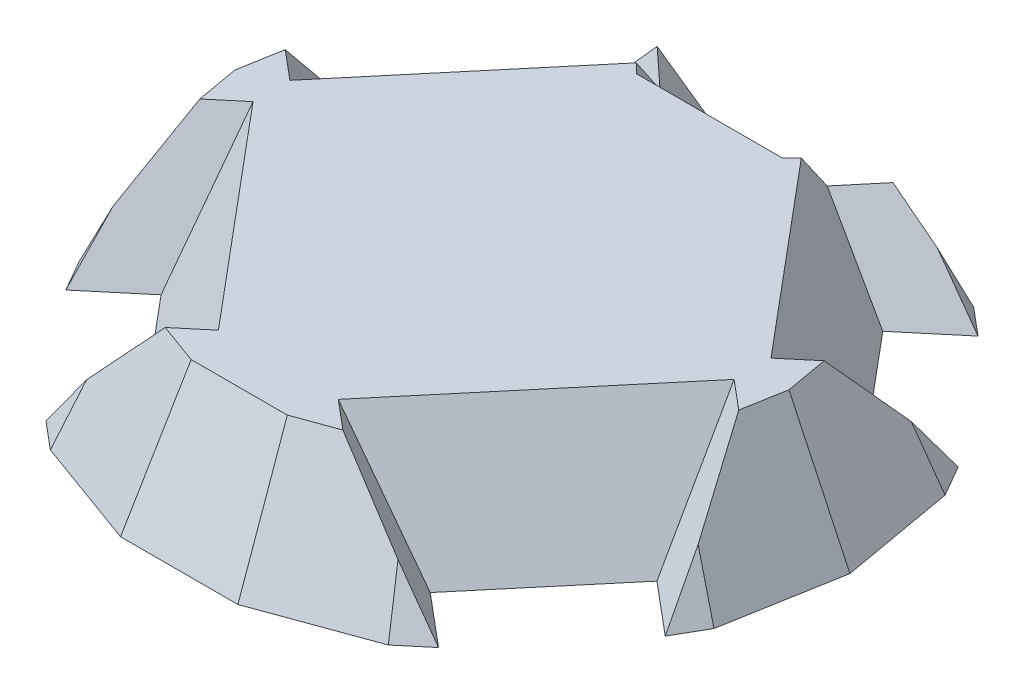
ISO-10303-21;
HEADER;
FILE_DESCRIPTION(('STEP AP214'),'2;1');
FILE_NAME('part.step','',(''),(''),'','','');
FILE_SCHEMA(('AUTOMOTIVE_DESIGN { 1 0 10303 214 1 1 1 1 }'));
ENDSEC;
DATA;
#1=APPLICATION_CONTEXT('core data for automotive mechanical design processes');
#2=APPLICATION_PROTOCOL_DEFINITION('international standard','automotive_design',2000,#1);
#3=PRODUCT_CONTEXT('',#1,'mechanical');
#4=PRODUCT('Part','Part','',(#3));
#5=PRODUCT_RELATED_PRODUCT_CATEGORY('part','',(#4));
#6=PRODUCT_DEFINITION_FORMATION('','',#4);
#7=PRODUCT_DEFINITION_CONTEXT('part definition',#1,'design');
#8=PRODUCT_DEFINITION('design','',#6,#7);
#9=PRODUCT_DEFINITION_SHAPE('','',#8);
#10=(LENGTH_UNIT() NAMED_UNIT(*) SI_UNIT(.MILLI.,.METRE.));
#11=(NAMED_UNIT(*) PLANE_ANGLE_UNIT() SI_UNIT($,.RADIAN.));
#12=(NAMED_UNIT(*) SI_UNIT($,.STERADIAN.) SOLID_ANGLE_UNIT());
#13=UNCERTAINTY_MEASURE_WITH_UNIT(LENGTH_MEASURE(1.E-05),#10,'distance_accuracy_value','');
#14=(GEOMETRIC_REPRESENTATION_CONTEXT(3) GLOBAL_UNCERTAINTY_ASSIGNED_CONTEXT((#13)) GLOBAL_UNIT_ASSIGNED_CONTEXT((#10,
#11,#12)) REPRESENTATION_CONTEXT('',''));
#15=CARTESIAN_POINT('',(0.,0.,0.));
#16=DIRECTION('',(0.,0.,1.));
#17=DIRECTION('',(1.,0.,0.));
#18=AXIS2_PLACEMENT_3D('',#15,#16,#17);
#19=CARTESIAN_POINT('',(-44.901185386243,0.,-70.3117503303196));
#20=DIRECTION('',(-0.582563416069544,0.4226182617407,0.694272044014918));
#21=DIRECTION('',(0.766044443119016,0.,0.642787609686494));
#22=AXIS2_PLACEMENT_3D('',#19,#20,#21);
#23=PLANE('',#22);
#24=DIRECTION('',(0.734072719411154,-0.0931354921715155,0.672653716792142));
#25=VECTOR('',#24,1.);
#26=CARTESIAN_POINT('',(-22.0545089369736,28.3170591017692,-68.3783128622616));
#27=LINE('',#26,#25);
#28=CARTESIAN_POINT('',(-36.6337385750285,30.1667991778082,-81.7377154727692));
#29=VERTEX_POINT('',#28);
#30=CARTESIAN_POINT('',(-25.9718081469977,28.8140665238695,-71.9678562463603));
#31=VERTEX_POINT('',#30);
#32=EDGE_CURVE('E11',#29,#31,#27,.T.);
#33=ORIENTED_EDGE('',*,*,#32,.F.);
#34=DIRECTION('',(0.671675882527513,0.731317139824388,0.118434580380747));
#35=VECTOR('',#34,1.);
#36=CARTESIAN_POINT('',(-51.1186258374389,14.3957307220478,-84.291791909652));
#37=LINE('',#36,#35);
#38=CARTESIAN_POINT('',(-48.387893569574,17.3689375375826,-83.8102901337363));
#39=VERTEX_POINT('',#38);
#40=EDGE_CURVE('E63',#39,#29,#37,.T.);
#41=ORIENTED_EDGE('',*,*,#40,.F.);
#42=DIRECTION('',(-0.587204142331029,-0.809438876771607,0.));
#43=VECTOR('',#42,1.);
#44=CARTESIAN_POINT('',(-55.4412040549403,7.64621369211995,-83.8102901337361));
#45=LINE('',#44,#43);
#46=CARTESIAN_POINT('',(-60.9881186917424,0.,-83.810290133736));
#47=VERTEX_POINT('',#46);
#48=EDGE_CURVE('E471',#39,#47,#45,.T.);
#49=ORIENTED_EDGE('',*,*,#48,.T.);
#50=DIRECTION('',(0.766044443119016,0.,0.642787609686494));
#51=VECTOR('',#50,1.);
#52=CARTESIAN_POINT('',(-44.901185386243,0.,-70.3117503303196));
#53=LINE('',#52,#51);
#54=CARTESIAN_POINT('',(-44.901185386243,0.,-70.3117503303196));
#55=VERTEX_POINT('',#54);
#56=EDGE_CURVE('E303',#47,#55,#53,.T.);
#57=ORIENTED_EDGE('',*,*,#56,.T.);
#58=DIRECTION('',(-0.548432424718698,-0.834817129478987,0.0479816198729543));
#59=VECTOR('',#58,1.);
#60=CARTESIAN_POINT('',(-44.901185386243,0.,-70.3117503303196));
#61=LINE('',#60,#59);
#62=EDGE_CURVE('E468',#31,#55,#61,.T.);
#63=ORIENTED_EDGE('',*,*,#62,.F.);
#64=EDGE_LOOP('',(#33,#41,#49,#57,#63));
#65=FACE_BOUND('',#64,.T.);
#66=ADVANCED_FACE('F47',(#65),#23,.T.);
#67=CARTESIAN_POINT('',(44.901185386243,0.,-70.3117503303196));
#68=DIRECTION('',(0.582563416069544,0.4226182617407,0.694272044014918));
#69=DIRECTION('',(0.766044443119016,0.,-0.642787609686494));
#70=AXIS2_PLACEMENT_3D('',#67,#68,#69);
#71=PLANE('',#70);
#72=DIRECTION('',(0.734072719411151,0.0931354921715225,-0.672653716792144));
#73=VECTOR('',#72,1.);
#74=CARTESIAN_POINT('',(22.0545089369736,28.317059101769,-68.3783128622615));
#75=LINE('',#74,#73);
#76=CARTESIAN_POINT('',(25.9718081469978,28.8140665238693,-71.9678562463603));
#77=VERTEX_POINT('',#76);
#78=CARTESIAN_POINT('',(36.6337385750286,30.1667991778082,-81.7377154727693));
#79=VERTEX_POINT('',#78);
#80=EDGE_CURVE('E56',#77,#79,#75,.T.);
#81=ORIENTED_EDGE('',*,*,#80,.F.);
#82=DIRECTION('',(0.548432424718699,-0.834817129478987,0.0479816198729543));
#83=VECTOR('',#82,1.);
#84=CARTESIAN_POINT('',(44.901185386243,0.,-70.3117503303196));
#85=LINE('',#84,#83);
#86=CARTESIAN_POINT('',(44.901185386243,0.,-70.3117503303196));
#87=VERTEX_POINT('',#86);
#88=EDGE_CURVE('E279',#77,#87,#85,.T.);
#89=ORIENTED_EDGE('',*,*,#88,.T.);
#90=DIRECTION('',(0.766044443119016,0.,-0.642787609686494));
#91=VECTOR('',#90,1.);
#92=CARTESIAN_POINT('',(44.901185386243,0.,-70.3117503303196));
#93=LINE('',#92,#91);
#94=CARTESIAN_POINT('',(60.9881186917424,0.,-83.810290133736));
#95=VERTEX_POINT('',#94);
#96=EDGE_CURVE('E271',#87,#95,#93,.T.);
#97=ORIENTED_EDGE('',*,*,#96,.T.);
#98=DIRECTION('',(0.587204142331029,-0.809438876771607,0.));
#99=VECTOR('',#98,1.);
#100=CARTESIAN_POINT('',(60.9881186917424,0.,-83.810290133736));
#101=LINE('',#100,#99);
#102=CARTESIAN_POINT('',(48.3878935695732,17.3689375375836,-83.8102901337363));
#103=VERTEX_POINT('',#102);
#104=EDGE_CURVE('E256',#103,#95,#101,.T.);
#105=ORIENTED_EDGE('',*,*,#104,.F.);
#106=DIRECTION('',(-0.671675882527515,0.731317139824386,0.11843458038075));
#107=VECTOR('',#106,1.);
#108=CARTESIAN_POINT('',(54.2728288506242,10.9614512041533,-84.8479630035086));
#109=LINE('',#108,#107);
#110=EDGE_CURVE('E583',#103,#79,#109,.T.);
#111=ORIENTED_EDGE('',*,*,#110,.T.);
#112=EDGE_LOOP('',(#81,#89,#97,#105,#111));
#113=FACE_BOUND('',#112,.T.);
#114=ADVANCED_FACE('F277',(#113),#71,.T.);
#115=CARTESIAN_POINT('',(60.9881186917424,0.,-83.810290133736));
#116=DIRECTION('',(0.582563416069579,0.4226182617407,-0.694272044014889));
#117=DIRECTION('',(-0.766044443118983,0.,-0.642787609686533));
#118=AXIS2_PLACEMENT_3D('',#115,#116,#117);
#119=PLANE('',#118);
#120=DIRECTION('',(-0.766044443118983,0.,-0.642787609686533));
#121=VECTOR('',#120,1.);
#122=CARTESIAN_POINT('',(60.9881186917424,0.,-83.810290133736));
#123=LINE('',#122,#121);
#124=CARTESIAN_POINT('',(52.4999999999999,0.,-90.932667397366));
#125=VERTEX_POINT('',#124);
#126=EDGE_CURVE('E258',#95,#125,#123,.T.);
#127=ORIENTED_EDGE('',*,*,#126,.T.);
#128=DIRECTION('',(0.213975625264829,-0.903801818525554,-0.370616654540007));
#129=VECTOR('',#128,1.);
#130=CARTESIAN_POINT('',(52.4999999999999,0.,-90.932667397366));
#131=LINE('',#130,#129);
#132=EDGE_CURVE('E260',#103,#125,#131,.T.);
#133=ORIENTED_EDGE('',*,*,#132,.F.);
#134=ORIENTED_EDGE('',*,*,#104,.T.);
#135=EDGE_LOOP('',(#127,#133,#134));
#136=FACE_BOUND('',#135,.T.);
#137=ADVANCED_FACE('F49',(#136),#119,.T.);
#138=CARTESIAN_POINT('',(52.4999999999999,0.,-90.932667397366));
#139=DIRECTION('',(0.309975519219444,0.4226182617407,-0.851650739639146));
#140=DIRECTION('',(0.,0.895772423772416,0.444512952352224));
#141=AXIS2_PLACEMENT_3D('',#138,#139,#140);
#142=PLANE('',#141);
#143=ORIENTED_EDGE('',*,*,#110,.F.);
#144=ORIENTED_EDGE('',*,*,#132,.T.);
#145=DIRECTION('',(-0.939692620785908,0.,-0.342020143325668));
#146=VECTOR('',#145,1.);
#147=CARTESIAN_POINT('',(52.4999999999999,0.,-90.932667397366));
#148=LINE('',#147,#146);
#149=CARTESIAN_POINT('',(33.0237208117051,0.,-98.0214532961636));
#150=VERTEX_POINT('',#149);
#151=EDGE_CURVE('E274',#125,#150,#148,.T.);
#152=ORIENTED_EDGE('',*,*,#151,.T.);
#153=DIRECTION('',(-0.104727184052516,-0.875143596761994,-0.472393799670265));
#154=VECTOR('',#153,1.);
#155=CARTESIAN_POINT('',(33.7177185820201,5.79933195333172,-94.8910316520816));
#156=LINE('',#155,#154);
#157=EDGE_CURVE('E489',#79,#150,#156,.T.);
#158=ORIENTED_EDGE('',*,*,#157,.F.);
#159=EDGE_LOOP('',(#143,#144,#152,#158));
#160=FACE_BOUND('',#159,.T.);
#161=ADVANCED_FACE('F590',(#160),#142,.T.);
#162=CARTESIAN_POINT('',(14.9999999999499,0.,-79.9977324844083));
#163=DIRECTION('',(-0.640856382055789,0.4226182617407,-0.640856382055787));
#164=DIRECTION('',(-0.707106781186546,0.,0.707106781186549));
#165=AXIS2_PLACEMENT_3D('',#162,#163,#164);
#166=PLANE('',#165);
#167=DIRECTION('',(0.0247779671125042,-0.822994454157543,-0.567508749511141));
#168=VECTOR('',#167,1.);
#169=CARTESIAN_POINT('',(26.6655660237844,5.7710588981427,-87.8575240036457));
#170=LINE('',#169,#168);
#171=CARTESIAN_POINT('',(25.6350322545309,40.,-64.2544201629398));
#172=VERTEX_POINT('',#171);
#173=EDGE_CURVE('E264',#172,#77,#170,.T.);
#174=ORIENTED_EDGE('',*,*,#173,.T.);
#175=ORIENTED_EDGE('',*,*,#80,.T.);
#176=ORIENTED_EDGE('',*,*,#157,.T.);
#177=DIRECTION('',(-0.707106781186546,0.,0.707106781186549));
#178=VECTOR('',#177,1.);
#179=CARTESIAN_POINT('',(14.9999999999499,0.,-79.9977324844083));
#180=LINE('',#179,#178);
#181=CARTESIAN_POINT('',(14.9999999999499,0.,-79.9977324844083));
#182=VERTEX_POINT('',#181);
#183=EDGE_CURVE('E286',#150,#182,#180,.T.);
#184=ORIENTED_EDGE('',*,*,#183,.T.);
#185=DIRECTION('',(-0.172432148269447,-0.892732563278757,-0.416288030941227));
#186=VECTOR('',#185,1.);
#187=CARTESIAN_POINT('',(14.9999999999499,0.,-79.9977324844083));
#188=LINE('',#187,#186);
#189=CARTESIAN_POINT('',(22.7260382497995,40.,-61.3454261582084));
#190=VERTEX_POINT('',#189);
#191=EDGE_CURVE('E485',#190,#182,#188,.T.);
#192=ORIENTED_EDGE('',*,*,#191,.F.);
#193=DIRECTION('',(0.707106781186546,0.,-0.707106781186549));
#194=VECTOR('',#193,1.);
#195=CARTESIAN_POINT('',(28.1891722879747,40.,-66.8085601963836));
#196=LINE('',#195,#194);
#197=EDGE_CURVE('E381',#172,#190,#196,.F.);
#198=ORIENTED_EDGE('',*,*,#197,.F.);
#199=EDGE_LOOP('',(#174,#175,#176,#184,#192,#198));
#200=FACE_BOUND('',#199,.T.);
#201=ADVANCED_FACE('F591',(#200),#166,.T.);
#202=CARTESIAN_POINT('',(-14.9999999999497,0.,-79.9977324844083));
#203=DIRECTION('',(0.,0.4226182617407,-0.90630778703665));
#204=DIRECTION('',(0.,0.90630778703665,0.4226182617407));
#205=AXIS2_PLACEMENT_3D('',#202,#203,#204);
#206=PLANE('',#205);
#207=DIRECTION('',(-1.,0.,0.));
#208=VECTOR('',#207,1.);
#209=CARTESIAN_POINT('',(-14.9999999999497,0.,-79.9977324844083));
#210=LINE('',#209,#208);
#211=CARTESIAN_POINT('',(-14.9999999999497,0.,-79.9977324844083));
#212=VERTEX_POINT('',#211);
#213=EDGE_CURVE('E289',#182,#212,#210,.T.);
#214=ORIENTED_EDGE('',*,*,#213,.T.);
#215=DIRECTION('',(0.172432148269446,-0.892732563278757,-0.416288030941227));
#216=VECTOR('',#215,1.);
#217=CARTESIAN_POINT('',(-14.9999999999497,0.,-79.9977324844083));
#218=LINE('',#217,#216);
#219=CARTESIAN_POINT('',(-22.7260382497991,40.,-61.3454261582084));
#220=VERTEX_POINT('',#219);
#221=EDGE_CURVE('E481',#220,#212,#218,.T.);
#222=ORIENTED_EDGE('',*,*,#221,.F.);
#223=DIRECTION('',(1.,0.,0.));
#224=VECTOR('',#223,1.);
#225=CARTESIAN_POINT('',(-14.9999999999497,40.,-61.3454261582084));
#226=LINE('',#225,#224);
#227=EDGE_CURVE('E496',#190,#220,#226,.F.);
#228=ORIENTED_EDGE('',*,*,#227,.F.);
#229=ORIENTED_EDGE('',*,*,#191,.T.);
#230=EDGE_LOOP('',(#214,#222,#228,#229));
#231=FACE_BOUND('',#230,.T.);
#232=ADVANCED_FACE('F597',(#231),#206,.T.);
#233=CARTESIAN_POINT('',(-14.9999999999497,0.,-79.9977324844083));
#234=DIRECTION('',(0.640856382055785,0.4226182617407,-0.640856382055792));
#235=DIRECTION('',(-0.707106781186551,0.,-0.707106781186544));
#236=AXIS2_PLACEMENT_3D('',#233,#234,#235);
#237=PLANE('',#236);
#238=DIRECTION('',(0.104727184052513,-0.875143596761994,-0.472393799670266));
#239=VECTOR('',#238,1.);
#240=CARTESIAN_POINT('',(-33.0237208117051,0.,-98.0214532961636));
#241=LINE('',#240,#239);
#242=CARTESIAN_POINT('',(-33.0237208117051,0.,-98.0214532961636));
#243=VERTEX_POINT('',#242);
#244=EDGE_CURVE('E478',#29,#243,#241,.T.);
#245=ORIENTED_EDGE('',*,*,#244,.F.);
#246=ORIENTED_EDGE('',*,*,#32,.T.);
#247=DIRECTION('',(-0.024777967112506,-0.822994454157544,-0.56750874951114));
#248=VECTOR('',#247,1.);
#249=CARTESIAN_POINT('',(-26.5477222839638,9.68521149545328,-85.1584586154478));
#250=LINE('',#249,#248);
#251=CARTESIAN_POINT('',(-25.6350322545308,40.,-64.25442016294));
#252=VERTEX_POINT('',#251);
#253=EDGE_CURVE('E562',#252,#31,#250,.T.);
#254=ORIENTED_EDGE('',*,*,#253,.F.);
#255=DIRECTION('',(0.707106781186551,0.,0.707106781186544));
#256=VECTOR('',#255,1.);
#257=CARTESIAN_POINT('',(-28.1891722879744,40.,-66.8085601963835));
#258=LINE('',#257,#256);
#259=EDGE_CURVE('E499',#220,#252,#258,.F.);
#260=ORIENTED_EDGE('',*,*,#259,.F.);
#261=ORIENTED_EDGE('',*,*,#221,.T.);
#262=DIRECTION('',(-0.707106781186551,0.,-0.707106781186544));
#263=VECTOR('',#262,1.);
#264=CARTESIAN_POINT('',(-14.9999999999497,0.,-79.9977324844083));
#265=LINE('',#264,#263);
#266=EDGE_CURVE('E292',#212,#243,#265,.T.);
#267=ORIENTED_EDGE('',*,*,#266,.T.);
#268=EDGE_LOOP('',(#245,#246,#254,#260,#261,#267));
#269=FACE_BOUND('',#268,.T.);
#270=ADVANCED_FACE('F604',(#269),#237,.T.);
#271=CARTESIAN_POINT('',(-33.0237208117051,0.,-98.0214532961636));
#272=DIRECTION('',(-0.309975519219452,0.4226182617407,-0.851650739639144));
#273=DIRECTION('',(0.,0.895772423772416,0.444512952352226));
#274=AXIS2_PLACEMENT_3D('',#271,#272,#273);
#275=PLANE('',#274);
#276=DIRECTION('',(-0.213975625264831,-0.903801818525554,-0.370616654540006));
#277=VECTOR('',#276,1.);
#278=CARTESIAN_POINT('',(-52.5000000000004,0.,-90.9326673973656));
#279=LINE('',#278,#277);
#280=CARTESIAN_POINT('',(-52.5000000000004,0.,-90.9326673973656));
#281=VERTEX_POINT('',#280);
#282=EDGE_CURVE('E475',#39,#281,#279,.T.);
#283=ORIENTED_EDGE('',*,*,#282,.F.);
#284=ORIENTED_EDGE('',*,*,#40,.T.);
#285=ORIENTED_EDGE('',*,*,#244,.T.);
#286=DIRECTION('',(-0.939692620785905,0.,0.342020143325676));
#287=VECTOR('',#286,1.);
#288=CARTESIAN_POINT('',(-33.0237208117051,0.,-98.0214532961636));
#289=LINE('',#288,#287);
#290=EDGE_CURVE('E296',#243,#281,#289,.T.);
#291=ORIENTED_EDGE('',*,*,#290,.T.);
#292=EDGE_LOOP('',(#283,#284,#285,#291));
#293=FACE_BOUND('',#292,.T.);
#294=ADVANCED_FACE('F721',(#293),#275,.T.);
#295=CARTESIAN_POINT('',(-52.5000000000004,0.,-90.9326673973656));
#296=DIRECTION('',(-0.58256341606958,0.4226182617407,-0.694272044014888));
#297=DIRECTION('',(-0.766044443118983,0.,0.642787609686534));
#298=AXIS2_PLACEMENT_3D('',#295,#296,#297);
#299=PLANE('',#298);
#300=DIRECTION('',(-0.766044443118983,0.,0.642787609686534));
#301=VECTOR('',#300,1.);
#302=CARTESIAN_POINT('',(-52.5000000000004,0.,-90.9326673973656));
#303=LINE('',#302,#301);
#304=EDGE_CURVE('E300',#281,#47,#303,.T.);
#305=ORIENTED_EDGE('',*,*,#304,.T.);
#306=ORIENTED_EDGE('',*,*,#48,.F.);
#307=ORIENTED_EDGE('',*,*,#282,.T.);
#308=EDGE_LOOP('',(#305,#306,#307));
#309=FACE_BOUND('',#308,.T.);
#310=ADVANCED_FACE('F720',(#309),#299,.T.);
#311=CARTESIAN_POINT('',(-44.901185386243,0.,-70.3117503303196));
#312=DIRECTION('',(-0.69427204401492,0.4226182617407,-0.582563416069542));
#313=DIRECTION('',(-0.642787609686492,0.,0.766044443119018));
#314=AXIS2_PLACEMENT_3D('',#311,#312,#313);
#315=PLANE('',#314);
#316=DIRECTION('',(0.642787609686492,0.,-0.766044443119018));
#317=VECTOR('',#316,1.);
#318=CARTESIAN_POINT('',(-30.6126897737038,40.,-58.3222789317612));
#319=LINE('',#318,#317);
#320=CARTESIAN_POINT('',(-74.7415416565866,40.,-5.73156116327122));
#321=VERTEX_POINT('',#320);
#322=EDGE_CURVE('E503',#252,#321,#319,.F.);
#323=ORIENTED_EDGE('',*,*,#322,.F.);
#324=ORIENTED_EDGE('',*,*,#253,.T.);
#325=ORIENTED_EDGE('',*,*,#62,.T.);
#326=DIRECTION('',(-0.642787609686492,0.,0.766044443119018));
#327=VECTOR('',#326,1.);
#328=CARTESIAN_POINT('',(-44.901185386243,0.,-70.3117503303196));
#329=LINE('',#328,#327);
#330=CARTESIAN_POINT('',(-77.0405658705675,0.,-32.0095281743688));
#331=VERTEX_POINT('',#330);
#332=EDGE_CURVE('E307',#55,#331,#329,.T.);
#333=ORIENTED_EDGE('',*,*,#332,.T.);
#334=DIRECTION('',(-0.0479816198729547,-0.834817129478987,-0.548432424718699));
#335=VECTOR('',#334,1.);
#336=CARTESIAN_POINT('',(-77.9744840078094,-16.248948254873,-42.6842613295333));
#337=LINE('',#336,#335);
#338=EDGE_CURVE('E464',#321,#331,#337,.T.);
#339=ORIENTED_EDGE('',*,*,#338,.F.);
#340=EDGE_LOOP('',(#323,#324,#325,#333,#339));
#341=FACE_BOUND('',#340,.T.);
#342=ADVANCED_FACE('F715',(#341),#315,.T.);
#343=CARTESIAN_POINT('',(-77.0405658705675,0.,-32.0095281743688));
#344=DIRECTION('',(0.582563416069543,0.4226182617407,-0.694272044014919));
#345=DIRECTION('',(-0.766044443119017,0.,-0.642787609686493));
#346=AXIS2_PLACEMENT_3D('',#343,#344,#345);
#347=PLANE('',#346);
#348=DIRECTION('',(-0.233270585967466,-0.731317139824421,-0.6409056675685));
#349=VECTOR('',#348,1.);
#350=CARTESIAN_POINT('',(-94.7436091576694,5.44280761750692,-43.5509917071984));
#351=LINE('',#350,#349);
#352=CARTESIAN_POINT('',(-83.7207900857823,40.,-13.2660452084575));
#353=VERTEX_POINT('',#352);
#354=CARTESIAN_POINT('',(-90.9394930454119,17.3689375375655,-33.0992685877883));
#355=VERTEX_POINT('',#354);
#356=EDGE_CURVE('E565',#353,#355,#351,.T.);
#357=ORIENTED_EDGE('',*,*,#356,.F.);
#358=DIRECTION('',(0.766044443119017,0.,0.642787609686493));
#359=VECTOR('',#358,1.);
#360=CARTESIAN_POINT('',(-89.0300372691258,40.,-17.7210325618296));
#361=LINE('',#360,#359);
#362=EDGE_CURVE('E506',#321,#353,#361,.F.);
#363=ORIENTED_EDGE('',*,*,#362,.F.);
#364=ORIENTED_EDGE('',*,*,#338,.T.);
#365=DIRECTION('',(-0.766044443119017,0.,-0.642787609686493));
#366=VECTOR('',#365,1.);
#367=CARTESIAN_POINT('',(-77.0405658705675,0.,-32.0095281743688));
#368=LINE('',#367,#366);
#369=CARTESIAN_POINT('',(-93.1274991760676,0.,-45.5080679777858));
#370=VERTEX_POINT('',#369);
#371=EDGE_CURVE('E310',#331,#370,#368,.T.);
#372=ORIENTED_EDGE('',*,*,#371,.T.);
#373=DIRECTION('',(-0.101966929234271,-0.809438876771627,-0.578283191968451));
#374=VECTOR('',#373,1.);
#375=CARTESIAN_POINT('',(-93.1274991760676,0.,-45.5080679777858));
#376=LINE('',#375,#374);
#377=EDGE_CURVE('E461',#355,#370,#376,.T.);
#378=ORIENTED_EDGE('',*,*,#377,.F.);
#379=EDGE_LOOP('',(#357,#363,#364,#372,#378));
#380=FACE_BOUND('',#379,.T.);
#381=ADVANCED_FACE('F710',(#380),#347,.T.);
#382=CARTESIAN_POINT('',(-93.1274991760676,0.,-45.5080679777858));
#383=DIRECTION('',(-0.784885567221399,0.4226182617407,-0.453153893518319));
#384=DIRECTION('',(-0.499999999999993,0.,0.866025403784442));
#385=AXIS2_PLACEMENT_3D('',#382,#383,#384);
#386=PLANE('',#385);
#387=DIRECTION('',(-0.499999999999993,0.,0.866025403784442));
#388=VECTOR('',#387,1.);
#389=CARTESIAN_POINT('',(-93.1274991760676,0.,-45.5080679777858));
#390=LINE('',#389,#388);
#391=CARTESIAN_POINT('',(-98.6677251825203,0.,-35.9121150491952));
#392=VERTEX_POINT('',#391);
#393=EDGE_CURVE('E314',#370,#392,#390,.T.);
#394=ORIENTED_EDGE('',*,*,#393,.T.);
#395=DIRECTION('',(-0.402142632178825,-0.903801818525554,-0.146367948042553));
#396=VECTOR('',#395,1.);
#397=CARTESIAN_POINT('',(-98.6677251825203,0.,-35.9121150491952));
#398=LINE('',#397,#396);
#399=EDGE_CURVE('E457',#355,#392,#398,.T.);
#400=ORIENTED_EDGE('',*,*,#399,.F.);
#401=ORIENTED_EDGE('',*,*,#377,.T.);
#402=EDGE_LOOP('',(#394,#400,#401));
#403=FACE_BOUND('',#402,.T.);
#404=ADVANCED_FACE('F708',(#403),#386,.T.);
#405=CARTESIAN_POINT('',(-98.6677251825203,0.,-35.9121150491952));
#406=DIRECTION('',(-0.89253893528903,0.4226182617407,-0.157378695624262));
#407=DIRECTION('',(-0.427951250529662,-0.903801818525554,0.));
#408=AXIS2_PLACEMENT_3D('',#405,#406,#407);
#409=PLANE('',#408);
#410=DIRECTION('',(0.17364817766693,0.,-0.984807753012208));
#411=VECTOR('',#410,1.);
#412=CARTESIAN_POINT('',(-80.2987893009199,40.,-32.6731760463652));
#413=LINE('',#412,#411);
#414=CARTESIAN_POINT('',(-86.0599517833316,40.,0.));
#415=VERTEX_POINT('',#414);
#416=EDGE_CURVE('E510',#353,#415,#413,.F.);
#417=ORIENTED_EDGE('',*,*,#416,.F.);
#418=ORIENTED_EDGE('',*,*,#356,.T.);
#419=ORIENTED_EDGE('',*,*,#399,.T.);
#420=DIRECTION('',(-0.17364817766693,0.,0.984807753012208));
#421=VECTOR('',#420,1.);
#422=CARTESIAN_POINT('',(-98.6677251825203,0.,-35.9121150491952));
#423=LINE('',#422,#421);
#424=CARTESIAN_POINT('',(-105.,0.,0.));
#425=VERTEX_POINT('',#424);
#426=EDGE_CURVE('E317',#392,#425,#423,.T.);
#427=ORIENTED_EDGE('',*,*,#426,.T.);
#428=DIRECTION('',(-0.427951250529662,-0.903801818525554,0.));
#429=VECTOR('',#428,1.);
#430=CARTESIAN_POINT('',(-105.,0.,0.));
#431=LINE('',#430,#429);
#432=EDGE_CURVE('E453',#415,#425,#431,.T.);
#433=ORIENTED_EDGE('',*,*,#432,.F.);
#434=EDGE_LOOP('',(#417,#418,#419,#427,#433));
#435=FACE_BOUND('',#434,.T.);
#436=ADVANCED_FACE('F704',(#435),#409,.T.);
#437=CARTESIAN_POINT('',(-105.,0.,0.));
#438=DIRECTION('',(-0.89253893528903,0.4226182617407,0.157378695624263));
#439=DIRECTION('',(-0.427951250529662,-0.903801818525554,0.));
#440=AXIS2_PLACEMENT_3D('',#437,#438,#439);
#441=PLANE('',#440);
#442=DIRECTION('',(-0.233270585967465,-0.731317139824421,0.640905667568499));
#443=VECTOR('',#442,1.);
#444=CARTESIAN_POINT('',(-92.9833096198914,10.9614512041509,38.7146084756775));
#445=LINE('',#444,#443);
#446=CARTESIAN_POINT('',(-83.7207900857823,40.,13.2660452084575));
#447=VERTEX_POINT('',#446);
#448=CARTESIAN_POINT('',(-90.9394930454119,17.3689375375654,33.0992685877884));
#449=VERTEX_POINT('',#448);
#450=EDGE_CURVE('E568',#447,#449,#445,.T.);
#451=ORIENTED_EDGE('',*,*,#450,.F.);
#452=DIRECTION('',(-0.173648177666931,0.,-0.984807753012208));
#453=VECTOR('',#452,1.);
#454=CARTESIAN_POINT('',(-86.6310641183995,40.,-3.23893900282996));
#455=LINE('',#454,#453);
#456=EDGE_CURVE('E513',#415,#447,#455,.F.);
#457=ORIENTED_EDGE('',*,*,#456,.F.);
#458=ORIENTED_EDGE('',*,*,#432,.T.);
#459=DIRECTION('',(0.173648177666931,0.,0.984807753012208));
#460=VECTOR('',#459,1.);
#461=CARTESIAN_POINT('',(-105.,0.,0.));
#462=LINE('',#461,#460);
#463=CARTESIAN_POINT('',(-98.6677251825202,0.,35.9121150491953));
#464=VERTEX_POINT('',#463);
#465=EDGE_CURVE('E320',#425,#464,#462,.T.);
#466=ORIENTED_EDGE('',*,*,#465,.T.);
#467=DIRECTION('',(-0.402142632178825,-0.903801818525554,0.146367948042553));
#468=VECTOR('',#467,1.);
#469=CARTESIAN_POINT('',(-98.6677251825202,0.,35.9121150491953));
#470=LINE('',#469,#468);
#471=EDGE_CURVE('E450',#449,#464,#470,.T.);
#472=ORIENTED_EDGE('',*,*,#471,.F.);
#473=EDGE_LOOP('',(#451,#457,#458,#466,#472));
#474=FACE_BOUND('',#473,.T.);
#475=ADVANCED_FACE('F696',(#474),#441,.T.);
#476=CARTESIAN_POINT('',(-98.6677251825202,0.,35.9121150491953));
#477=DIRECTION('',(-0.784885567221398,0.4226182617407,0.45315389351832));
#478=DIRECTION('',(0.499999999999994,0.,0.866025403784442));
#479=AXIS2_PLACEMENT_3D('',#476,#477,#478);
#480=PLANE('',#479);
#481=DIRECTION('',(0.499999999999994,0.,0.866025403784442));
#482=VECTOR('',#481,1.);
#483=CARTESIAN_POINT('',(-98.6677251825202,0.,35.9121150491953));
#484=LINE('',#483,#482);
#485=CARTESIAN_POINT('',(-93.1274991760676,0.,45.5080679777858));
#486=VERTEX_POINT('',#485);
#487=EDGE_CURVE('E324',#464,#486,#484,.T.);
#488=ORIENTED_EDGE('',*,*,#487,.T.);
#489=DIRECTION('',(-0.101966929234271,-0.809438876771627,0.578283191968451));
#490=VECTOR('',#489,1.);
#491=CARTESIAN_POINT('',(-92.1642875577128,7.64621369211971,40.0454234381668));
#492=LINE('',#491,#490);
#493=EDGE_CURVE('E446',#449,#486,#492,.T.);
#494=ORIENTED_EDGE('',*,*,#493,.F.);
#495=ORIENTED_EDGE('',*,*,#471,.T.);
#496=EDGE_LOOP('',(#488,#494,#495));
#497=FACE_BOUND('',#496,.T.);
#498=ADVANCED_FACE('F694',(#497),#480,.T.);
#499=CARTESIAN_POINT('',(-77.0405658705675,0.,32.0095281743688));
#500=DIRECTION('',(0.582563416069543,0.4226182617407,0.694272044014919));
#501=DIRECTION('',(0.766044443119017,0.,-0.642787609686493));
#502=AXIS2_PLACEMENT_3D('',#499,#500,#501);
#503=PLANE('',#502);
#504=DIRECTION('',(-0.766044443119017,0.,0.642787609686493));
#505=VECTOR('',#504,1.);
#506=CARTESIAN_POINT('',(-89.0300372691258,40.,17.7210325618296));
#507=LINE('',#506,#505);
#508=CARTESIAN_POINT('',(-74.7415416565866,40.,5.73156116327122));
#509=VERTEX_POINT('',#508);
#510=EDGE_CURVE('E517',#447,#509,#507,.F.);
#511=ORIENTED_EDGE('',*,*,#510,.F.);
#512=ORIENTED_EDGE('',*,*,#450,.T.);
#513=ORIENTED_EDGE('',*,*,#493,.T.);
#514=DIRECTION('',(0.766044443119017,0.,-0.642787609686493));
#515=VECTOR('',#514,1.);
#516=CARTESIAN_POINT('',(-77.0405658705675,0.,32.0095281743688));
#517=LINE('',#516,#515);
#518=CARTESIAN_POINT('',(-77.0405658705675,0.,32.0095281743688));
#519=VERTEX_POINT('',#518);
#520=EDGE_CURVE('E327',#486,#519,#517,.T.);
#521=ORIENTED_EDGE('',*,*,#520,.T.);
#522=DIRECTION('',(-0.0479816198729547,-0.834817129478987,0.548432424718699));
#523=VECTOR('',#522,1.);
#524=CARTESIAN_POINT('',(-77.0405658705675,0.,32.0095281743688));
#525=LINE('',#524,#523);
#526=EDGE_CURVE('E442',#509,#519,#525,.T.);
#527=ORIENTED_EDGE('',*,*,#526,.F.);
#528=EDGE_LOOP('',(#511,#512,#513,#521,#527));
#529=FACE_BOUND('',#528,.T.);
#530=ADVANCED_FACE('F690',(#529),#503,.T.);
#531=CARTESIAN_POINT('',(-44.901185386243,0.,70.3117503303196));
#532=DIRECTION('',(-0.69427204401492,0.4226182617407,0.582563416069542));
#533=DIRECTION('',(0.642787609686492,0.,0.766044443119018));
#534=AXIS2_PLACEMENT_3D('',#531,#532,#533);
#535=PLANE('',#534);
#536=DIRECTION('',(0.642787609686492,0.,0.766044443119018));
#537=VECTOR('',#536,1.);
#538=CARTESIAN_POINT('',(-44.901185386243,0.,70.3117503303196));
#539=LINE('',#538,#537);
#540=CARTESIAN_POINT('',(-44.901185386243,0.,70.3117503303196));
#541=VERTEX_POINT('',#540);
#542=EDGE_CURVE('E330',#519,#541,#539,.T.);
#543=ORIENTED_EDGE('',*,*,#542,.T.);
#544=DIRECTION('',(-0.548432424718699,-0.834817129478987,-0.0479816198729543));
#545=VECTOR('',#544,1.);
#546=CARTESIAN_POINT('',(-44.901185386243,0.,70.3117503303196));
#547=LINE('',#546,#545);
#548=CARTESIAN_POINT('',(-18.6232183751455,40.,72.6107745443004));
#549=VERTEX_POINT('',#548);
#550=EDGE_CURVE('E438',#549,#541,#547,.T.);
#551=ORIENTED_EDGE('',*,*,#550,.F.);
#552=DIRECTION('',(-0.642787609686492,0.,-0.766044443119018));
#553=VECTOR('',#552,1.);
#554=CARTESIAN_POINT('',(-30.6126897737038,40.,58.3222789317612));
#555=LINE('',#554,#553);
#556=EDGE_CURVE('E520',#509,#549,#555,.F.);
#557=ORIENTED_EDGE('',*,*,#556,.F.);
#558=ORIENTED_EDGE('',*,*,#526,.T.);
#559=EDGE_LOOP('',(#543,#551,#557,#558));
#560=FACE_BOUND('',#559,.T.);
#561=ADVANCED_FACE('F683',(#560),#535,.T.);
#562=CARTESIAN_POINT('',(-44.901185386243,0.,70.3117503303196));
#563=DIRECTION('',(-0.582563416069544,0.4226182617407,-0.694272044014918));
#564=DIRECTION('',(-0.766044443119016,0.,0.642787609686494));
#565=AXIS2_PLACEMENT_3D('',#562,#563,#564);
#566=PLANE('',#565);
#567=DIRECTION('',(-0.671675882527515,-0.731317139824385,0.11843458038075));
#568=VECTOR('',#567,1.);
#569=CARTESIAN_POINT('',(-59.3414093604439,5.44280761751364,85.7416905012827));
#570=LINE('',#569,#568);
#571=CARTESIAN_POINT('',(-27.602466804341,40.,80.1452585894866));
#572=VERTEX_POINT('',#571);
#573=CARTESIAN_POINT('',(-48.3878935695733,17.3689375375836,83.8102901337363));
#574=VERTEX_POINT('',#573);
#575=EDGE_CURVE('E571',#572,#574,#570,.T.);
#576=ORIENTED_EDGE('',*,*,#575,.F.);
#577=DIRECTION('',(0.766044443119016,0.,-0.642787609686494));
#578=VECTOR('',#577,1.);
#579=CARTESIAN_POINT('',(-32.9117139876846,40.,84.6002459428587));
#580=LINE('',#579,#578);
#581=EDGE_CURVE('E523',#549,#572,#580,.F.);
#582=ORIENTED_EDGE('',*,*,#581,.F.);
#583=ORIENTED_EDGE('',*,*,#550,.T.);
#584=DIRECTION('',(-0.766044443119016,0.,0.642787609686494));
#585=VECTOR('',#584,1.);
#586=CARTESIAN_POINT('',(-44.901185386243,0.,70.3117503303196));
#587=LINE('',#586,#585);
#588=CARTESIAN_POINT('',(-60.9881186917424,0.,83.810290133736));
#589=VERTEX_POINT('',#588);
#590=EDGE_CURVE('E333',#541,#589,#587,.T.);
#591=ORIENTED_EDGE('',*,*,#590,.T.);
#592=DIRECTION('',(-0.587204142331029,-0.809438876771606,0.));
#593=VECTOR('',#592,1.);
#594=CARTESIAN_POINT('',(-60.9881186917424,0.,83.810290133736));
#595=LINE('',#594,#593);
#596=EDGE_CURVE('E435',#574,#589,#595,.T.);
#597=ORIENTED_EDGE('',*,*,#596,.F.);
#598=EDGE_LOOP('',(#576,#582,#583,#591,#597));
#599=FACE_BOUND('',#598,.T.);
#600=ADVANCED_FACE('F678',(#599),#566,.T.);
#601=CARTESIAN_POINT('',(-60.9881186917424,0.,83.810290133736));
#602=DIRECTION('',(-0.582563416069578,0.4226182617407,0.694272044014889));
#603=DIRECTION('',(0.766044443118984,0.,0.642787609686532));
#604=AXIS2_PLACEMENT_3D('',#601,#602,#603);
#605=PLANE('',#604);
#606=DIRECTION('',(0.766044443118984,0.,0.642787609686532));
#607=VECTOR('',#606,1.);
#608=CARTESIAN_POINT('',(-60.9881186917424,0.,83.810290133736));
#609=LINE('',#608,#607);
#610=CARTESIAN_POINT('',(-52.4999999999999,0.,90.932667397366));
#611=VERTEX_POINT('',#610);
#612=EDGE_CURVE('E337',#589,#611,#609,.T.);
#613=ORIENTED_EDGE('',*,*,#612,.T.);
#614=DIRECTION('',(-0.213975625264829,-0.903801818525554,0.370616654540007));
#615=VECTOR('',#614,1.);
#616=CARTESIAN_POINT('',(-52.4999999999999,0.,90.932667397366));
#617=LINE('',#616,#615);
#618=EDGE_CURVE('E431',#574,#611,#617,.T.);
#619=ORIENTED_EDGE('',*,*,#618,.F.);
#620=ORIENTED_EDGE('',*,*,#596,.T.);
#621=EDGE_LOOP('',(#613,#619,#620));
#622=FACE_BOUND('',#621,.T.);
#623=ADVANCED_FACE('F675',(#622),#605,.T.);
#624=CARTESIAN_POINT('',(-52.4999999999999,0.,90.932667397366));
#625=DIRECTION('',(-0.309975519219443,0.4226182617407,0.851650739639147));
#626=DIRECTION('',(0.,-0.895772423772416,0.444512952352224));
#627=AXIS2_PLACEMENT_3D('',#624,#625,#626);
#628=PLANE('',#627);
#629=DIRECTION('',(-0.939692620785909,0.,-0.342020143325667));
#630=VECTOR('',#629,1.);
#631=CARTESIAN_POINT('',(-46.1205355169587,40.,73.4052327819975));
#632=LINE('',#631,#630);
#633=CARTESIAN_POINT('',(-14.9441537972789,40.,84.7525077400819));
#634=VERTEX_POINT('',#633);
#635=EDGE_CURVE('E527',#572,#634,#632,.F.);
#636=ORIENTED_EDGE('',*,*,#635,.F.);
#637=ORIENTED_EDGE('',*,*,#575,.T.);
#638=ORIENTED_EDGE('',*,*,#618,.T.);
#639=DIRECTION('',(0.939692620785909,0.,0.342020143325667));
#640=VECTOR('',#639,1.);
#641=CARTESIAN_POINT('',(-52.4999999999999,0.,90.932667397366));
#642=LINE('',#641,#640);
#643=CARTESIAN_POINT('',(-18.233058655027,0.,103.404814066282));
#644=VERTEX_POINT('',#643);
#645=EDGE_CURVE('E340',#611,#644,#642,.T.);
#646=ORIENTED_EDGE('',*,*,#645,.T.);
#647=DIRECTION('',(-0.0743129547847579,-0.903801818525554,0.421449709432882));
#648=VECTOR('',#647,1.);
#649=CARTESIAN_POINT('',(-18.233058655027,0.,103.404814066282));
#650=LINE('',#649,#648);
#651=EDGE_CURVE('E427',#634,#644,#650,.T.);
#652=ORIENTED_EDGE('',*,*,#651,.F.);
#653=EDGE_LOOP('',(#636,#637,#638,#646,#652));
#654=FACE_BOUND('',#653,.T.);
#655=ADVANCED_FACE('F669',(#654),#628,.T.);
#656=CARTESIAN_POINT('',(-18.233058655027,0.,103.404814066282));
#657=DIRECTION('',(0.,0.4226182617407,0.90630778703665));
#658=DIRECTION('',(0.,-0.90630778703665,0.4226182617407));
#659=AXIS2_PLACEMENT_3D('',#656,#657,#658);
#660=PLANE('',#659);
#661=DIRECTION('',(1.,0.,0.));
#662=VECTOR('',#661,1.);
#663=CARTESIAN_POINT('',(-18.233058655027,0.,103.404814066282));
#664=LINE('',#663,#662);
#665=CARTESIAN_POINT('',(18.2330586550285,0.,103.404814066282));
#666=VERTEX_POINT('',#665);
#667=EDGE_CURVE('E343',#644,#666,#664,.T.);
#668=ORIENTED_EDGE('',*,*,#667,.T.);
#669=DIRECTION('',(0.0743129547847625,-0.903801818525554,0.421449709432881));
#670=VECTOR('',#669,1.);
#671=CARTESIAN_POINT('',(18.2330586550285,0.,103.404814066282));
#672=LINE('',#671,#670);
#673=CARTESIAN_POINT('',(14.9441537972801,40.,84.7525077400817));
#674=VERTEX_POINT('',#673);
#675=EDGE_CURVE('E423',#674,#666,#672,.T.);
#676=ORIENTED_EDGE('',*,*,#675,.F.);
#677=DIRECTION('',(-1.,0.,0.));
#678=VECTOR('',#677,1.);
#679=CARTESIAN_POINT('',(-18.2330586550271,40.,84.7525077400819));
#680=LINE('',#679,#678);
#681=EDGE_CURVE('E530',#634,#674,#680,.F.);
#682=ORIENTED_EDGE('',*,*,#681,.F.);
#683=ORIENTED_EDGE('',*,*,#651,.T.);
#684=EDGE_LOOP('',(#668,#676,#682,#683));
#685=FACE_BOUND('',#684,.T.);
#686=ADVANCED_FACE('F665',(#685),#660,.T.);
#687=CARTESIAN_POINT('',(18.2330586550285,0.,103.404814066282));
#688=DIRECTION('',(0.309975519219449,0.4226182617407,0.851650739639144));
#689=DIRECTION('',(0.,-0.895772423772416,0.444512952352225));
#690=AXIS2_PLACEMENT_3D('',#687,#688,#689);
#691=PLANE('',#690);
#692=DIRECTION('',(0.671675882527513,-0.731317139824387,0.118434580380748));
#693=VECTOR('',#692,1.);
#694=CARTESIAN_POINT('',(54.2728288506242,10.9614512041532,84.8479630035086));
#695=LINE('',#694,#693);
#696=CARTESIAN_POINT('',(27.6024668043411,40.,80.1452585894867));
#697=VERTEX_POINT('',#696);
#698=CARTESIAN_POINT('',(48.3878935695734,17.3689375375835,83.8102901337363));
#699=VERTEX_POINT('',#698);
#700=EDGE_CURVE('E574',#697,#699,#695,.T.);
#701=ORIENTED_EDGE('',*,*,#700,.F.);
#702=DIRECTION('',(-0.939692620785906,0.,0.342020143325674));
#703=VECTOR('',#702,1.);
#704=CARTESIAN_POINT('',(11.8535941719872,40.,85.8773794509133));
#705=LINE('',#704,#703);
#706=EDGE_CURVE('E533',#674,#697,#705,.F.);
#707=ORIENTED_EDGE('',*,*,#706,.F.);
#708=ORIENTED_EDGE('',*,*,#675,.T.);
#709=DIRECTION('',(0.939692620785906,0.,-0.342020143325674));
#710=VECTOR('',#709,1.);
#711=CARTESIAN_POINT('',(18.2330586550285,0.,103.404814066282));
#712=LINE('',#711,#710);
#713=CARTESIAN_POINT('',(52.5,0.,90.932667397366));
#714=VERTEX_POINT('',#713);
#715=EDGE_CURVE('E346',#666,#714,#712,.T.);
#716=ORIENTED_EDGE('',*,*,#715,.T.);
#717=DIRECTION('',(0.213975625264831,-0.903801818525554,0.370616654540006));
#718=VECTOR('',#717,1.);
#719=CARTESIAN_POINT('',(52.5,0.,90.932667397366));
#720=LINE('',#719,#718);
#721=EDGE_CURVE('E420',#699,#714,#720,.T.);
#722=ORIENTED_EDGE('',*,*,#721,.F.);
#723=EDGE_LOOP('',(#701,#707,#708,#716,#722));
#724=FACE_BOUND('',#723,.T.);
#725=ADVANCED_FACE('F660',(#724),#691,.T.);
#726=CARTESIAN_POINT('',(52.5,0.,90.932667397366));
#727=DIRECTION('',(0.58256341606958,0.4226182617407,0.694272044014888));
#728=DIRECTION('',(0.766044443118982,0.,-0.642787609686534));
#729=AXIS2_PLACEMENT_3D('',#726,#727,#728);
#730=PLANE('',#729);
#731=DIRECTION('',(0.766044443118982,0.,-0.642787609686534));
#732=VECTOR('',#731,1.);
#733=CARTESIAN_POINT('',(52.5,0.,90.932667397366));
#734=LINE('',#733,#732);
#735=CARTESIAN_POINT('',(60.9881186917424,0.,83.810290133736));
#736=VERTEX_POINT('',#735);
#737=EDGE_CURVE('E350',#714,#736,#734,.T.);
#738=ORIENTED_EDGE('',*,*,#737,.T.);
#739=DIRECTION('',(0.587204142331029,-0.809438876771607,0.));
#740=VECTOR('',#739,1.);
#741=CARTESIAN_POINT('',(55.4412040549403,7.64621369211995,83.8102901337362));
#742=LINE('',#741,#740);
#743=EDGE_CURVE('E416',#699,#736,#742,.T.);
#744=ORIENTED_EDGE('',*,*,#743,.F.);
#745=ORIENTED_EDGE('',*,*,#721,.T.);
#746=EDGE_LOOP('',(#738,#744,#745));
#747=FACE_BOUND('',#746,.T.);
#748=ADVANCED_FACE('F655',(#747),#730,.T.);
#749=CARTESIAN_POINT('',(44.901185386243,0.,70.3117503303196));
#750=DIRECTION('',(0.582563416069544,0.4226182617407,-0.694272044014918));
#751=DIRECTION('',(-0.766044443119016,0.,-0.642787609686494));
#752=AXIS2_PLACEMENT_3D('',#749,#750,#751);
#753=PLANE('',#752);
#754=DIRECTION('',(0.766044443119016,0.,0.642787609686494));
#755=VECTOR('',#754,1.);
#756=CARTESIAN_POINT('',(32.9117139876846,40.,84.6002459428587));
#757=LINE('',#756,#755);
#758=CARTESIAN_POINT('',(18.6232183751455,40.,72.6107745443004));
#759=VERTEX_POINT('',#758);
#760=EDGE_CURVE('E537',#697,#759,#757,.F.);
#761=ORIENTED_EDGE('',*,*,#760,.F.);
#762=ORIENTED_EDGE('',*,*,#700,.T.);
#763=ORIENTED_EDGE('',*,*,#743,.T.);
#764=DIRECTION('',(-0.766044443119016,0.,-0.642787609686494));
#765=VECTOR('',#764,1.);
#766=CARTESIAN_POINT('',(44.901185386243,0.,70.3117503303196));
#767=LINE('',#766,#765);
#768=CARTESIAN_POINT('',(44.901185386243,0.,70.3117503303196));
#769=VERTEX_POINT('',#768);
#770=EDGE_CURVE('E353',#736,#769,#767,.T.);
#771=ORIENTED_EDGE('',*,*,#770,.T.);
#772=DIRECTION('',(0.548432424718698,-0.834817129478987,-0.0479816198729543));
#773=VECTOR('',#772,1.);
#774=CARTESIAN_POINT('',(44.901185386243,0.,70.3117503303196));
#775=LINE('',#774,#773);
#776=EDGE_CURVE('E412',#759,#769,#775,.T.);
#777=ORIENTED_EDGE('',*,*,#776,.F.);
#778=EDGE_LOOP('',(#761,#762,#763,#771,#777));
#779=FACE_BOUND('',#778,.T.);
#780=ADVANCED_FACE('F651',(#779),#753,.T.);
#781=CARTESIAN_POINT('',(44.901185386243,0.,70.3117503303196));
#782=DIRECTION('',(0.69427204401492,0.4226182617407,0.582563416069542));
#783=DIRECTION('',(0.642787609686492,0.,-0.766044443119018));
#784=AXIS2_PLACEMENT_3D('',#781,#782,#783);
#785=PLANE('',#784);
#786=DIRECTION('',(0.642787609686492,0.,-0.766044443119018));
#787=VECTOR('',#786,1.);
#788=CARTESIAN_POINT('',(44.901185386243,0.,70.3117503303196));
#789=LINE('',#788,#787);
#790=CARTESIAN_POINT('',(77.0405658705675,0.,32.0095281743688));
#791=VERTEX_POINT('',#790);
#792=EDGE_CURVE('E356',#769,#791,#789,.T.);
#793=ORIENTED_EDGE('',*,*,#792,.T.);
#794=DIRECTION('',(0.0479816198729547,-0.834817129478987,0.548432424718699));
#795=VECTOR('',#794,1.);
#796=CARTESIAN_POINT('',(77.9744840078094,-16.248948254873,42.6842613295333));
#797=LINE('',#796,#795);
#798=CARTESIAN_POINT('',(74.7415416565866,40.,5.73156116327122));
#799=VERTEX_POINT('',#798);
#800=EDGE_CURVE('E408',#799,#791,#797,.T.);
#801=ORIENTED_EDGE('',*,*,#800,.F.);
#802=DIRECTION('',(-0.642787609686492,0.,0.766044443119018));
#803=VECTOR('',#802,1.);
#804=CARTESIAN_POINT('',(30.6126897737038,40.,58.3222789317612));
#805=LINE('',#804,#803);
#806=EDGE_CURVE('E540',#759,#799,#805,.F.);
#807=ORIENTED_EDGE('',*,*,#806,.F.);
#808=ORIENTED_EDGE('',*,*,#776,.T.);
#809=EDGE_LOOP('',(#793,#801,#807,#808));
#810=FACE_BOUND('',#809,.T.);
#811=ADVANCED_FACE('F646',(#810),#785,.T.);
#812=CARTESIAN_POINT('',(77.0405658705675,0.,32.0095281743688));
#813=DIRECTION('',(-0.582563416069543,0.4226182617407,0.694272044014919));
#814=DIRECTION('',(0.766044443119017,0.,0.642787609686493));
#815=AXIS2_PLACEMENT_3D('',#812,#813,#814);
#816=PLANE('',#815);
#817=DIRECTION('',(0.233270585967465,-0.731317139824421,0.640905667568499));
#818=VECTOR('',#817,1.);
#819=CARTESIAN_POINT('',(94.7436091576694,5.44280761750691,43.5509917071984));
#820=LINE('',#819,#818);
#821=CARTESIAN_POINT('',(83.7207900857823,40.,13.2660452084575));
#822=VERTEX_POINT('',#821);
#823=CARTESIAN_POINT('',(90.9394930454119,17.3689375375655,33.0992685877883));
#824=VERTEX_POINT('',#823);
#825=EDGE_CURVE('E577',#822,#824,#820,.T.);
#826=ORIENTED_EDGE('',*,*,#825,.F.);
#827=DIRECTION('',(-0.766044443119017,0.,-0.642787609686493));
#828=VECTOR('',#827,1.);
#829=CARTESIAN_POINT('',(89.0300372691258,40.,17.7210325618296));
#830=LINE('',#829,#828);
#831=EDGE_CURVE('E543',#799,#822,#830,.F.);
#832=ORIENTED_EDGE('',*,*,#831,.F.);
#833=ORIENTED_EDGE('',*,*,#800,.T.);
#834=DIRECTION('',(0.766044443119017,0.,0.642787609686493));
#835=VECTOR('',#834,1.);
#836=CARTESIAN_POINT('',(77.0405658705675,0.,32.0095281743688));
#837=LINE('',#836,#835);
#838=CARTESIAN_POINT('',(93.1274991760676,0.,45.5080679777858));
#839=VERTEX_POINT('',#838);
#840=EDGE_CURVE('E359',#791,#839,#837,.T.);
#841=ORIENTED_EDGE('',*,*,#840,.T.);
#842=DIRECTION('',(0.101966929234271,-0.809438876771627,0.578283191968451));
#843=VECTOR('',#842,1.);
#844=CARTESIAN_POINT('',(93.1274991760676,0.,45.5080679777858));
#845=LINE('',#844,#843);
#846=EDGE_CURVE('E405',#824,#839,#845,.T.);
#847=ORIENTED_EDGE('',*,*,#846,.F.);
#848=EDGE_LOOP('',(#826,#832,#833,#841,#847));
#849=FACE_BOUND('',#848,.T.);
#850=ADVANCED_FACE('F639',(#849),#816,.T.);
#851=CARTESIAN_POINT('',(93.1274991760676,0.,45.5080679777858));
#852=DIRECTION('',(0.784885567221399,0.4226182617407,0.453153893518318));
#853=DIRECTION('',(0.499999999999993,0.,-0.866025403784443));
#854=AXIS2_PLACEMENT_3D('',#851,#852,#853);
#855=PLANE('',#854);
#856=DIRECTION('',(0.499999999999992,0.,-0.866025403784443));
#857=VECTOR('',#856,1.);
#858=CARTESIAN_POINT('',(93.1274991760676,0.,45.5080679777858));
#859=LINE('',#858,#857);
#860=CARTESIAN_POINT('',(98.6677251825203,0.,35.9121150491952));
#861=VERTEX_POINT('',#860);
#862=EDGE_CURVE('E363',#839,#861,#859,.T.);
#863=ORIENTED_EDGE('',*,*,#862,.T.);
#864=DIRECTION('',(0.402142632178825,-0.903801818525554,0.146367948042553));
#865=VECTOR('',#864,1.);
#866=CARTESIAN_POINT('',(98.6677251825203,0.,35.9121150491952));
#867=LINE('',#866,#865);
#868=EDGE_CURVE('E401',#824,#861,#867,.T.);
#869=ORIENTED_EDGE('',*,*,#868,.F.);
#870=ORIENTED_EDGE('',*,*,#846,.T.);
#871=EDGE_LOOP('',(#863,#869,#870));
#872=FACE_BOUND('',#871,.T.);
#873=ADVANCED_FACE('F637',(#872),#855,.T.);
#874=CARTESIAN_POINT('',(98.6677251825203,0.,35.9121150491952));
#875=DIRECTION('',(0.89253893528903,0.4226182617407,0.157378695624263));
#876=DIRECTION('',(-0.427951250529662,0.903801818525554,0.));
#877=AXIS2_PLACEMENT_3D('',#874,#875,#876);
#878=PLANE('',#877);
#879=DIRECTION('',(-0.17364817766693,0.,0.984807753012208));
#880=VECTOR('',#879,1.);
#881=CARTESIAN_POINT('',(80.2987893009199,40.,32.6731760463652));
#882=LINE('',#881,#880);
#883=CARTESIAN_POINT('',(86.0599517833316,40.,0.));
#884=VERTEX_POINT('',#883);
#885=EDGE_CURVE('E547',#822,#884,#882,.F.);
#886=ORIENTED_EDGE('',*,*,#885,.F.);
#887=ORIENTED_EDGE('',*,*,#825,.T.);
#888=ORIENTED_EDGE('',*,*,#868,.T.);
#889=DIRECTION('',(0.17364817766693,0.,-0.984807753012208));
#890=VECTOR('',#889,1.);
#891=CARTESIAN_POINT('',(98.6677251825203,0.,35.9121150491952));
#892=LINE('',#891,#890);
#893=CARTESIAN_POINT('',(105.,0.,0.));
#894=VERTEX_POINT('',#893);
#895=EDGE_CURVE('E366',#861,#894,#892,.T.);
#896=ORIENTED_EDGE('',*,*,#895,.T.);
#897=DIRECTION('',(0.427951250529662,-0.903801818525554,0.));
#898=VECTOR('',#897,1.);
#899=CARTESIAN_POINT('',(105.,0.,0.));
#900=LINE('',#899,#898);
#901=EDGE_CURVE('E397',#884,#894,#900,.T.);
#902=ORIENTED_EDGE('',*,*,#901,.F.);
#903=EDGE_LOOP('',(#886,#887,#888,#896,#902));
#904=FACE_BOUND('',#903,.T.);
#905=ADVANCED_FACE('F633',(#904),#878,.T.);
#906=CARTESIAN_POINT('',(105.,0.,0.));
#907=DIRECTION('',(0.89253893528903,0.4226182617407,-0.157378695624263));
#908=DIRECTION('',(-0.427951250529662,0.903801818525554,0.));
#909=AXIS2_PLACEMENT_3D('',#906,#907,#908);
#910=PLANE('',#909);
#911=DIRECTION('',(0.233270585967465,-0.731317139824421,-0.640905667568499));
#912=VECTOR('',#911,1.);
#913=CARTESIAN_POINT('',(92.9833096198915,10.9614512041509,-38.7146084756775));
#914=LINE('',#913,#912);
#915=CARTESIAN_POINT('',(83.7207900857823,40.,-13.2660452084575));
#916=VERTEX_POINT('',#915);
#917=CARTESIAN_POINT('',(90.9394930454119,17.3689375375653,-33.0992685877884));
#918=VERTEX_POINT('',#917);
#919=EDGE_CURVE('E580',#916,#918,#914,.T.);
#920=ORIENTED_EDGE('',*,*,#919,.F.);
#921=DIRECTION('',(0.173648177666931,0.,0.984807753012208));
#922=VECTOR('',#921,1.);
#923=CARTESIAN_POINT('',(86.6310641183995,40.,3.23893900282994));
#924=LINE('',#923,#922);
#925=EDGE_CURVE('E550',#884,#916,#924,.F.);
#926=ORIENTED_EDGE('',*,*,#925,.F.);
#927=ORIENTED_EDGE('',*,*,#901,.T.);
#928=DIRECTION('',(-0.173648177666931,0.,-0.984807753012208));
#929=VECTOR('',#928,1.);
#930=CARTESIAN_POINT('',(105.,0.,0.));
#931=LINE('',#930,#929);
#932=CARTESIAN_POINT('',(98.6677251825202,0.,-35.9121150491953));
#933=VERTEX_POINT('',#932);
#934=EDGE_CURVE('E369',#894,#933,#931,.T.);
#935=ORIENTED_EDGE('',*,*,#934,.T.);
#936=DIRECTION('',(0.402142632178825,-0.903801818525554,-0.146367948042553));
#937=VECTOR('',#936,1.);
#938=CARTESIAN_POINT('',(98.6677251825202,0.,-35.9121150491953));
#939=LINE('',#938,#937);
#940=EDGE_CURVE('E394',#918,#933,#939,.T.);
#941=ORIENTED_EDGE('',*,*,#940,.F.);
#942=EDGE_LOOP('',(#920,#926,#927,#935,#941));
#943=FACE_BOUND('',#942,.T.);
#944=ADVANCED_FACE('F625',(#943),#910,.T.);
#945=CARTESIAN_POINT('',(98.6677251825202,0.,-35.9121150491953));
#946=DIRECTION('',(0.784885567221398,0.4226182617407,-0.45315389351832));
#947=DIRECTION('',(-0.499999999999995,0.,-0.866025403784441));
#948=AXIS2_PLACEMENT_3D('',#945,#946,#947);
#949=PLANE('',#948);
#950=DIRECTION('',(-0.499999999999995,0.,-0.866025403784441));
#951=VECTOR('',#950,1.);
#952=CARTESIAN_POINT('',(98.6677251825202,0.,-35.9121150491953));
#953=LINE('',#952,#951);
#954=CARTESIAN_POINT('',(93.1274991760676,0.,-45.5080679777858));
#955=VERTEX_POINT('',#954);
#956=EDGE_CURVE('E373',#933,#955,#953,.T.);
#957=ORIENTED_EDGE('',*,*,#956,.T.);
#958=DIRECTION('',(0.10196692923427,-0.809438876771627,-0.57828319196845));
#959=VECTOR('',#958,1.);
#960=CARTESIAN_POINT('',(92.1642875577128,7.64621369211971,-40.0454234381668));
#961=LINE('',#960,#959);
#962=EDGE_CURVE('E390',#918,#955,#961,.T.);
#963=ORIENTED_EDGE('',*,*,#962,.F.);
#964=ORIENTED_EDGE('',*,*,#940,.T.);
#965=EDGE_LOOP('',(#957,#963,#964));
#966=FACE_BOUND('',#965,.T.);
#967=ADVANCED_FACE('F623',(#966),#949,.T.);
#968=CARTESIAN_POINT('',(77.0405658705675,0.,-32.0095281743688));
#969=DIRECTION('',(-0.582563416069543,0.4226182617407,-0.694272044014919));
#970=DIRECTION('',(-0.766044443119017,0.,0.642787609686493));
#971=AXIS2_PLACEMENT_3D('',#968,#969,#970);
#972=PLANE('',#971);
#973=DIRECTION('',(0.766044443119017,0.,-0.642787609686493));
#974=VECTOR('',#973,1.);
#975=CARTESIAN_POINT('',(89.0300372691258,40.,-17.7210325618296));
#976=LINE('',#975,#974);
#977=CARTESIAN_POINT('',(74.7415416565866,40.,-5.73156116327122));
#978=VERTEX_POINT('',#977);
#979=EDGE_CURVE('E554',#916,#978,#976,.F.);
#980=ORIENTED_EDGE('',*,*,#979,.F.);
#981=ORIENTED_EDGE('',*,*,#919,.T.);
#982=ORIENTED_EDGE('',*,*,#962,.T.);
#983=DIRECTION('',(-0.766044443119017,0.,0.642787609686493));
#984=VECTOR('',#983,1.);
#985=CARTESIAN_POINT('',(77.0405658705675,0.,-32.0095281743688));
#986=LINE('',#985,#984);
#987=CARTESIAN_POINT('',(77.0405658705675,0.,-32.0095281743688));
#988=VERTEX_POINT('',#987);
#989=EDGE_CURVE('E376',#955,#988,#986,.T.);
#990=ORIENTED_EDGE('',*,*,#989,.T.);
#991=DIRECTION('',(0.0479816198729547,-0.834817129478987,-0.548432424718699));
#992=VECTOR('',#991,1.);
#993=CARTESIAN_POINT('',(77.0405658705675,0.,-32.0095281743688));
#994=LINE('',#993,#992);
#995=EDGE_CURVE('E385',#978,#988,#994,.T.);
#996=ORIENTED_EDGE('',*,*,#995,.F.);
#997=EDGE_LOOP('',(#980,#981,#982,#990,#996));
#998=FACE_BOUND('',#997,.T.);
#999=ADVANCED_FACE('F619',(#998),#972,.T.);
#1000=CARTESIAN_POINT('',(44.901185386243,0.,-70.3117503303196));
#1001=DIRECTION('',(0.69427204401492,0.4226182617407,-0.582563416069542));
#1002=DIRECTION('',(-0.642787609686492,0.,-0.766044443119018));
#1003=AXIS2_PLACEMENT_3D('',#1000,#1001,#1002);
#1004=PLANE('',#1003);
#1005=ORIENTED_EDGE('',*,*,#173,.F.);
#1006=DIRECTION('',(0.642787609686492,0.,0.766044443119018));
#1007=VECTOR('',#1006,1.);
#1008=CARTESIAN_POINT('',(30.6126897737038,40.,-58.3222789317612));
#1009=LINE('',#1008,#1007);
#1010=EDGE_CURVE('E386',#978,#172,#1009,.F.);
#1011=ORIENTED_EDGE('',*,*,#1010,.F.);
#1012=ORIENTED_EDGE('',*,*,#995,.T.);
#1013=DIRECTION('',(-0.642787609686492,0.,-0.766044443119018));
#1014=VECTOR('',#1013,1.);
#1015=CARTESIAN_POINT('',(44.901185386243,0.,-70.3117503303196));
#1016=LINE('',#1015,#1014);
#1017=EDGE_CURVE('E379',#988,#87,#1016,.T.);
#1018=ORIENTED_EDGE('',*,*,#1017,.T.);
#1019=ORIENTED_EDGE('',*,*,#88,.F.);
#1020=EDGE_LOOP('',(#1005,#1011,#1012,#1018,#1019));
#1021=FACE_BOUND('',#1020,.T.);
#1022=ADVANCED_FACE('F612',(#1021),#1004,.T.);
#1023=CARTESIAN_POINT('',(0.,40.,0.));
#1024=DIRECTION('',(0.,1.,0.));
#1025=DIRECTION('',(0.,0.,1.));
#1026=AXIS2_PLACEMENT_3D('',#1023,#1024,#1025);
#1027=PLANE('',#1026);
#1028=ORIENTED_EDGE('',*,*,#1010,.T.);
#1029=ORIENTED_EDGE('',*,*,#197,.T.);
#1030=ORIENTED_EDGE('',*,*,#227,.T.);
#1031=ORIENTED_EDGE('',*,*,#259,.T.);
#1032=ORIENTED_EDGE('',*,*,#322,.T.);
#1033=ORIENTED_EDGE('',*,*,#362,.T.);
#1034=ORIENTED_EDGE('',*,*,#416,.T.);
#1035=ORIENTED_EDGE('',*,*,#456,.T.);
#1036=ORIENTED_EDGE('',*,*,#510,.T.);
#1037=ORIENTED_EDGE('',*,*,#556,.T.);
#1038=ORIENTED_EDGE('',*,*,#581,.T.);
#1039=ORIENTED_EDGE('',*,*,#635,.T.);
#1040=ORIENTED_EDGE('',*,*,#681,.T.);
#1041=ORIENTED_EDGE('',*,*,#706,.T.);
#1042=ORIENTED_EDGE('',*,*,#760,.T.);
#1043=ORIENTED_EDGE('',*,*,#806,.T.);
#1044=ORIENTED_EDGE('',*,*,#831,.T.);
#1045=ORIENTED_EDGE('',*,*,#885,.T.);
#1046=ORIENTED_EDGE('',*,*,#925,.T.);
#1047=ORIENTED_EDGE('',*,*,#979,.T.);
#1048=EDGE_LOOP('',(#1028,#1029,#1030,#1031,#1032,#1033,#1034,#1035,#1036,#1037,#1038,#1039,
#1040,#1041,#1042,#1043,#1044,#1045,#1046,#1047));
#1049=FACE_BOUND('',#1048,.T.);
#1050=ADVANCED_FACE('F608',(#1049),#1027,.T.);
#1051=CARTESIAN_POINT('',(0.,0.,0.));
#1052=DIRECTION('',(0.,1.,0.));
#1053=DIRECTION('',(0.,0.,1.));
#1054=AXIS2_PLACEMENT_3D('',#1051,#1052,#1053);
#1055=PLANE('',#1054);
#1056=ORIENTED_EDGE('',*,*,#96,.F.);
#1057=ORIENTED_EDGE('',*,*,#1017,.F.);
#1058=ORIENTED_EDGE('',*,*,#989,.F.);
#1059=ORIENTED_EDGE('',*,*,#956,.F.);
#1060=ORIENTED_EDGE('',*,*,#934,.F.);
#1061=ORIENTED_EDGE('',*,*,#895,.F.);
#1062=ORIENTED_EDGE('',*,*,#862,.F.);
#1063=ORIENTED_EDGE('',*,*,#840,.F.);
#1064=ORIENTED_EDGE('',*,*,#792,.F.);
#1065=ORIENTED_EDGE('',*,*,#770,.F.);
#1066=ORIENTED_EDGE('',*,*,#737,.F.);
#1067=ORIENTED_EDGE('',*,*,#715,.F.);
#1068=ORIENTED_EDGE('',*,*,#667,.F.);
#1069=ORIENTED_EDGE('',*,*,#645,.F.);
#1070=ORIENTED_EDGE('',*,*,#612,.F.);
#1071=ORIENTED_EDGE('',*,*,#590,.F.);
#1072=ORIENTED_EDGE('',*,*,#542,.F.);
#1073=ORIENTED_EDGE('',*,*,#520,.F.);
#1074=ORIENTED_EDGE('',*,*,#487,.F.);
#1075=ORIENTED_EDGE('',*,*,#465,.F.);
#1076=ORIENTED_EDGE('',*,*,#426,.F.);
#1077=ORIENTED_EDGE('',*,*,#393,.F.);
#1078=ORIENTED_EDGE('',*,*,#371,.F.);
#1079=ORIENTED_EDGE('',*,*,#332,.F.);
#1080=ORIENTED_EDGE('',*,*,#56,.F.);
#1081=ORIENTED_EDGE('',*,*,#304,.F.);
#1082=ORIENTED_EDGE('',*,*,#290,.F.);
#1083=ORIENTED_EDGE('',*,*,#266,.F.);
#1084=ORIENTED_EDGE('',*,*,#213,.F.);
#1085=ORIENTED_EDGE('',*,*,#183,.F.);
#1086=ORIENTED_EDGE('',*,*,#151,.F.);
#1087=ORIENTED_EDGE('',*,*,#126,.F.);
#1088=EDGE_LOOP('',(#1056,#1057,#1058,#1059,#1060,#1061,#1062,#1063,#1064,#1065,#1066,#1067,
#1068,#1069,#1070,#1071,#1072,#1073,#1074,#1075,#1076,#1077,#1078,#1079,#1080,#1081,#1082,#1083,
#1084,#1085,#1086,#1087));
#1089=FACE_BOUND('',#1088,.T.);
#1090=ADVANCED_FACE('F269',(#1089),#1055,.F.);
#1091=CLOSED_SHELL('',(#66,#114,#137,#161,#201,#232,#270,#294,#310,#342,#381,#404,#436,#475,
#498,#530,#561,#600,#623,#655,#686,#725,#748,#780,#811,#850,#873,#905,#944,#967,#999,#1022,
#1050,#1090));
#1092=MANIFOLD_SOLID_BREP('B2',#1091);
#1093=ADVANCED_BREP_SHAPE_REPRESENTATION('',(#18,#1092),#14);
#1094=SHAPE_DEFINITION_REPRESENTATION(#9,#1093);
ENDSEC;
END-ISO-10303-21;
